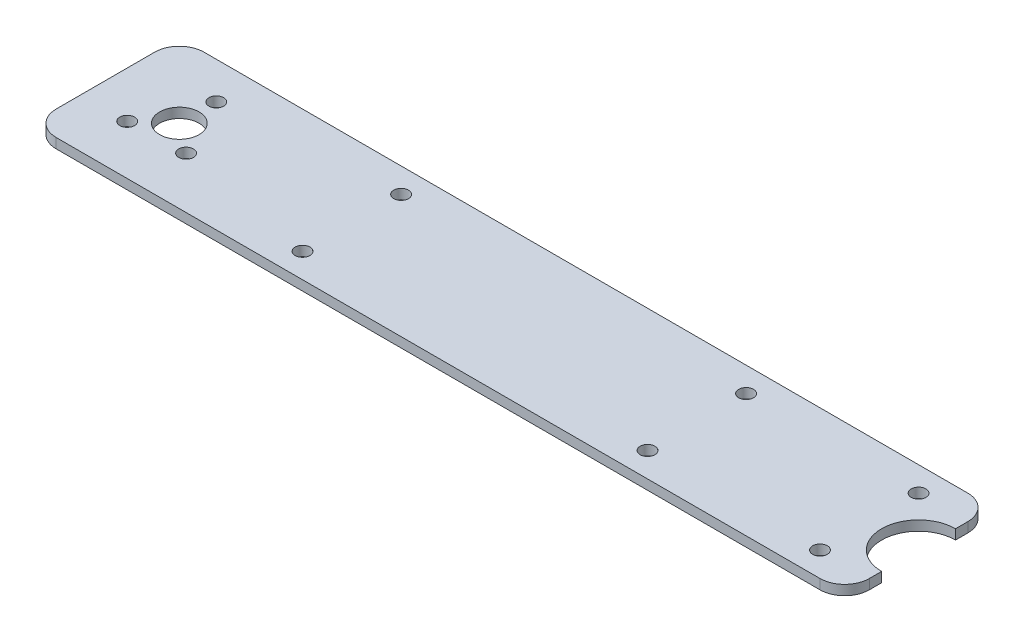
ISO-10303-21;
HEADER;
FILE_DESCRIPTION(('STEP AP214'),'2;1');
FILE_NAME('part.step','',(''),(''),'','','');
FILE_SCHEMA(('AUTOMOTIVE_DESIGN { 1 0 10303 214 1 1 1 1 }'));
ENDSEC;
DATA;
#1=APPLICATION_CONTEXT('core data for automotive mechanical design processes');
#2=APPLICATION_PROTOCOL_DEFINITION('international standard','automotive_design',2000,#1);
#3=PRODUCT_CONTEXT('',#1,'mechanical');
#4=PRODUCT('Part','Part','',(#3));
#5=PRODUCT_RELATED_PRODUCT_CATEGORY('part','',(#4));
#6=PRODUCT_DEFINITION_FORMATION('','',#4);
#7=PRODUCT_DEFINITION_CONTEXT('part definition',#1,'design');
#8=PRODUCT_DEFINITION('design','',#6,#7);
#9=PRODUCT_DEFINITION_SHAPE('','',#8);
#10=(LENGTH_UNIT() NAMED_UNIT(*) SI_UNIT(.MILLI.,.METRE.));
#11=(NAMED_UNIT(*) PLANE_ANGLE_UNIT() SI_UNIT($,.RADIAN.));
#12=(NAMED_UNIT(*) SI_UNIT($,.STERADIAN.) SOLID_ANGLE_UNIT());
#13=UNCERTAINTY_MEASURE_WITH_UNIT(LENGTH_MEASURE(1.E-05),#10,'distance_accuracy_value','');
#14=(GEOMETRIC_REPRESENTATION_CONTEXT(3) GLOBAL_UNCERTAINTY_ASSIGNED_CONTEXT((#13)) GLOBAL_UNIT_ASSIGNED_CONTEXT((#10,
#11,#12)) REPRESENTATION_CONTEXT('',''));
#15=CARTESIAN_POINT('',(0.,0.,0.));
#16=DIRECTION('',(0.,0.,1.));
#17=DIRECTION('',(1.,0.,0.));
#18=AXIS2_PLACEMENT_3D('',#15,#16,#17);
#19=CARTESIAN_POINT('',(82.5,2.,-15.));
#20=DIRECTION('',(-1.,0.,0.));
#21=DIRECTION('',(0.,0.,1.));
#22=AXIS2_PLACEMENT_3D('',#19,#20,#21);
#23=PLANE('',#22);
#24=DIRECTION('',(0.,0.,-1.));
#25=VECTOR('',#24,1.);
#26=CARTESIAN_POINT('',(82.5,0.,-15.));
#27=LINE('',#26,#25);
#28=CARTESIAN_POINT('',(82.5,0.,10.));
#29=VERTEX_POINT('',#28);
#30=CARTESIAN_POINT('',(82.5,0.,7.5));
#31=VERTEX_POINT('',#30);
#32=EDGE_CURVE('E126',#29,#31,#27,.T.);
#33=ORIENTED_EDGE('',*,*,#32,.T.);
#34=DIRECTION('',(0.,1.,0.));
#35=VECTOR('',#34,1.);
#36=CARTESIAN_POINT('',(82.5,-8.,7.5));
#37=LINE('',#36,#35);
#38=CARTESIAN_POINT('',(82.5,2.,7.5));
#39=VERTEX_POINT('',#38);
#40=EDGE_CURVE('E49',#31,#39,#37,.T.);
#41=ORIENTED_EDGE('',*,*,#40,.T.);
#42=DIRECTION('',(0.,0.,-1.));
#43=VECTOR('',#42,1.);
#44=CARTESIAN_POINT('',(82.5,2.,-15.));
#45=LINE('',#44,#43);
#46=CARTESIAN_POINT('',(82.5,2.,10.));
#47=VERTEX_POINT('',#46);
#48=EDGE_CURVE('E123',#47,#39,#45,.T.);
#49=ORIENTED_EDGE('',*,*,#48,.F.);
#50=DIRECTION('',(0.,-1.,0.));
#51=VECTOR('',#50,1.);
#52=CARTESIAN_POINT('',(82.5,2.,10.));
#53=LINE('',#52,#51);
#54=EDGE_CURVE('E160',#47,#29,#53,.T.);
#55=ORIENTED_EDGE('',*,*,#54,.T.);
#56=EDGE_LOOP('',(#33,#41,#49,#55));
#57=FACE_BOUND('',#56,.T.);
#58=ADVANCED_FACE('F32',(#57),#23,.F.);
#59=CARTESIAN_POINT('',(82.5,2.,-7.5));
#60=VERTEX_POINT('',#59);
#61=CARTESIAN_POINT('',(82.5,2.,-10.));
#62=VERTEX_POINT('',#61);
#63=EDGE_CURVE('E135',#60,#62,#45,.T.);
#64=ORIENTED_EDGE('',*,*,#63,.F.);
#65=DIRECTION('',(0.,1.,0.));
#66=VECTOR('',#65,1.);
#67=CARTESIAN_POINT('',(82.5,-8.,-7.5));
#68=LINE('',#67,#66);
#69=CARTESIAN_POINT('',(82.5,0.,-7.5));
#70=VERTEX_POINT('',#69);
#71=EDGE_CURVE('E113',#60,#70,#68,.F.);
#72=ORIENTED_EDGE('',*,*,#71,.T.);
#73=CARTESIAN_POINT('',(82.5,0.,-10.));
#74=VERTEX_POINT('',#73);
#75=EDGE_CURVE('E151',#70,#74,#27,.T.);
#76=ORIENTED_EDGE('',*,*,#75,.T.);
#77=DIRECTION('',(0.,-1.,0.));
#78=VECTOR('',#77,1.);
#79=CARTESIAN_POINT('',(82.5,2.,-10.));
#80=LINE('',#79,#78);
#81=EDGE_CURVE('E148',#74,#62,#80,.F.);
#82=ORIENTED_EDGE('',*,*,#81,.T.);
#83=EDGE_LOOP('',(#64,#72,#76,#82));
#84=FACE_BOUND('',#83,.T.);
#85=ADVANCED_FACE('F257',(#84),#23,.F.);
#86=CARTESIAN_POINT('',(-82.5,2.,-15.));
#87=DIRECTION('',(0.,0.,1.));
#88=DIRECTION('',(1.,0.,0.));
#89=AXIS2_PLACEMENT_3D('',#86,#87,#88);
#90=PLANE('',#89);
#91=DIRECTION('',(-1.,0.,0.));
#92=VECTOR('',#91,1.);
#93=CARTESIAN_POINT('',(-82.5,2.,-15.));
#94=LINE('',#93,#92);
#95=CARTESIAN_POINT('',(77.5,2.,-15.));
#96=VERTEX_POINT('',#95);
#97=CARTESIAN_POINT('',(-77.5,2.,-15.));
#98=VERTEX_POINT('',#97);
#99=EDGE_CURVE('E134',#96,#98,#94,.T.);
#100=ORIENTED_EDGE('',*,*,#99,.F.);
#101=DIRECTION('',(0.,-1.,0.));
#102=VECTOR('',#101,1.);
#103=CARTESIAN_POINT('',(77.5,2.,-15.));
#104=LINE('',#103,#102);
#105=CARTESIAN_POINT('',(77.5,0.,-15.));
#106=VERTEX_POINT('',#105);
#107=EDGE_CURVE('E185',#96,#106,#104,.T.);
#108=ORIENTED_EDGE('',*,*,#107,.T.);
#109=DIRECTION('',(-1.,0.,0.));
#110=VECTOR('',#109,1.);
#111=CARTESIAN_POINT('',(-82.5,0.,-15.));
#112=LINE('',#111,#110);
#113=CARTESIAN_POINT('',(-77.5,0.,-15.));
#114=VERTEX_POINT('',#113);
#115=EDGE_CURVE('E150',#106,#114,#112,.T.);
#116=ORIENTED_EDGE('',*,*,#115,.T.);
#117=DIRECTION('',(0.,-1.,0.));
#118=VECTOR('',#117,1.);
#119=CARTESIAN_POINT('',(-77.5,2.,-15.));
#120=LINE('',#119,#118);
#121=EDGE_CURVE('E183',#114,#98,#120,.F.);
#122=ORIENTED_EDGE('',*,*,#121,.T.);
#123=EDGE_LOOP('',(#100,#108,#116,#122));
#124=FACE_BOUND('',#123,.T.);
#125=ADVANCED_FACE('F262',(#124),#90,.F.);
#126=CARTESIAN_POINT('',(-82.5,2.,-15.));
#127=DIRECTION('',(1.,0.,0.));
#128=DIRECTION('',(0.,0.,-1.));
#129=AXIS2_PLACEMENT_3D('',#126,#127,#128);
#130=PLANE('',#129);
#131=DIRECTION('',(0.,0.,1.));
#132=VECTOR('',#131,1.);
#133=CARTESIAN_POINT('',(-82.5,2.,-15.));
#134=LINE('',#133,#132);
#135=CARTESIAN_POINT('',(-82.5,2.,-10.));
#136=VERTEX_POINT('',#135);
#137=CARTESIAN_POINT('',(-82.5,2.,10.));
#138=VERTEX_POINT('',#137);
#139=EDGE_CURVE('E138',#136,#138,#134,.T.);
#140=ORIENTED_EDGE('',*,*,#139,.F.);
#141=DIRECTION('',(0.,-1.,0.));
#142=VECTOR('',#141,1.);
#143=CARTESIAN_POINT('',(-82.5,2.,-10.));
#144=LINE('',#143,#142);
#145=CARTESIAN_POINT('',(-82.5,0.,-10.));
#146=VERTEX_POINT('',#145);
#147=EDGE_CURVE('E41',#136,#146,#144,.T.);
#148=ORIENTED_EDGE('',*,*,#147,.T.);
#149=DIRECTION('',(0.,0.,1.));
#150=VECTOR('',#149,1.);
#151=CARTESIAN_POINT('',(-82.5,0.,-15.));
#152=LINE('',#151,#150);
#153=CARTESIAN_POINT('',(-82.5,0.,10.));
#154=VERTEX_POINT('',#153);
#155=EDGE_CURVE('E154',#146,#154,#152,.T.);
#156=ORIENTED_EDGE('',*,*,#155,.T.);
#157=DIRECTION('',(0.,-1.,0.));
#158=VECTOR('',#157,1.);
#159=CARTESIAN_POINT('',(-82.5,2.,10.));
#160=LINE('',#159,#158);
#161=EDGE_CURVE('E56',#154,#138,#160,.F.);
#162=ORIENTED_EDGE('',*,*,#161,.T.);
#163=EDGE_LOOP('',(#140,#148,#156,#162));
#164=FACE_BOUND('',#163,.T.);
#165=ADVANCED_FACE('F250',(#164),#130,.F.);
#166=CARTESIAN_POINT('',(-82.5,2.,15.));
#167=DIRECTION('',(0.,0.,-1.));
#168=DIRECTION('',(-1.,0.,0.));
#169=AXIS2_PLACEMENT_3D('',#166,#167,#168);
#170=PLANE('',#169);
#171=DIRECTION('',(1.,0.,0.));
#172=VECTOR('',#171,1.);
#173=CARTESIAN_POINT('',(-82.5,0.,15.));
#174=LINE('',#173,#172);
#175=CARTESIAN_POINT('',(-77.5,0.,15.));
#176=VERTEX_POINT('',#175);
#177=CARTESIAN_POINT('',(77.5,0.,15.));
#178=VERTEX_POINT('',#177);
#179=EDGE_CURVE('E140',#176,#178,#174,.T.);
#180=ORIENTED_EDGE('',*,*,#179,.T.);
#181=DIRECTION('',(0.,-1.,0.));
#182=VECTOR('',#181,1.);
#183=CARTESIAN_POINT('',(77.5,2.,15.));
#184=LINE('',#183,#182);
#185=CARTESIAN_POINT('',(77.5,2.,15.));
#186=VERTEX_POINT('',#185);
#187=EDGE_CURVE('E174',#178,#186,#184,.F.);
#188=ORIENTED_EDGE('',*,*,#187,.T.);
#189=DIRECTION('',(1.,0.,0.));
#190=VECTOR('',#189,1.);
#191=CARTESIAN_POINT('',(-82.5,2.,15.));
#192=LINE('',#191,#190);
#193=CARTESIAN_POINT('',(-77.5,2.,15.));
#194=VERTEX_POINT('',#193);
#195=EDGE_CURVE('E146',#194,#186,#192,.T.);
#196=ORIENTED_EDGE('',*,*,#195,.F.);
#197=DIRECTION('',(0.,-1.,0.));
#198=VECTOR('',#197,1.);
#199=CARTESIAN_POINT('',(-77.5,2.,15.));
#200=LINE('',#199,#198);
#201=EDGE_CURVE('E171',#194,#176,#200,.T.);
#202=ORIENTED_EDGE('',*,*,#201,.T.);
#203=EDGE_LOOP('',(#180,#188,#196,#202));
#204=FACE_BOUND('',#203,.T.);
#205=ADVANCED_FACE('F240',(#204),#170,.F.);
#206=CARTESIAN_POINT('',(0.,2.,0.));
#207=DIRECTION('',(0.,1.,0.));
#208=DIRECTION('',(0.,0.,1.));
#209=AXIS2_PLACEMENT_3D('',#206,#207,#208);
#210=PLANE('',#209);
#211=CARTESIAN_POINT('',(72.5,2.,10.));
#212=DIRECTION('',(0.,1.,0.));
#213=DIRECTION('',(0.,0.,1.));
#214=AXIS2_PLACEMENT_3D('',#211,#212,#213);
#215=CIRCLE('',#214,1.5);
#216=CARTESIAN_POINT('',(72.5,2.,11.5));
#217=VERTEX_POINT('',#216);
#218=EDGE_CURVE('E464',#217,#217,#215,.T.);
#219=ORIENTED_EDGE('',*,*,#218,.F.);
#220=EDGE_LOOP('',(#219));
#221=FACE_BOUND('',#220,.T.);
#222=CARTESIAN_POINT('',(72.5,2.,-10.));
#223=DIRECTION('',(0.,1.,0.));
#224=DIRECTION('',(0.,0.,1.));
#225=AXIS2_PLACEMENT_3D('',#222,#223,#224);
#226=CIRCLE('',#225,1.5);
#227=CARTESIAN_POINT('',(72.5,2.,-8.5));
#228=VERTEX_POINT('',#227);
#229=EDGE_CURVE('E466',#228,#228,#226,.T.);
#230=ORIENTED_EDGE('',*,*,#229,.F.);
#231=EDGE_LOOP('',(#230));
#232=FACE_BOUND('',#231,.T.);
#233=CARTESIAN_POINT('',(37.5,2.,-10.));
#234=DIRECTION('',(0.,1.,0.));
#235=DIRECTION('',(0.,0.,1.));
#236=AXIS2_PLACEMENT_3D('',#233,#234,#235);
#237=CIRCLE('',#236,1.5);
#238=CARTESIAN_POINT('',(37.5,2.,-8.49999999999999));
#239=VERTEX_POINT('',#238);
#240=EDGE_CURVE('E197',#239,#239,#237,.T.);
#241=ORIENTED_EDGE('',*,*,#240,.F.);
#242=EDGE_LOOP('',(#241));
#243=FACE_BOUND('',#242,.T.);
#244=CARTESIAN_POINT('',(-32.5,2.,10.));
#245=DIRECTION('',(0.,1.,0.));
#246=DIRECTION('',(0.,0.,1.));
#247=AXIS2_PLACEMENT_3D('',#244,#245,#246);
#248=CIRCLE('',#247,1.5);
#249=CARTESIAN_POINT('',(-32.5,2.,11.5));
#250=VERTEX_POINT('',#249);
#251=EDGE_CURVE('E475',#250,#250,#248,.T.);
#252=ORIENTED_EDGE('',*,*,#251,.F.);
#253=EDGE_LOOP('',(#252));
#254=FACE_BOUND('',#253,.T.);
#255=CARTESIAN_POINT('',(37.5,2.,10.));
#256=DIRECTION('',(0.,1.,0.));
#257=DIRECTION('',(0.,0.,1.));
#258=AXIS2_PLACEMENT_3D('',#255,#256,#257);
#259=CIRCLE('',#258,1.5);
#260=CARTESIAN_POINT('',(37.5,2.,11.5));
#261=VERTEX_POINT('',#260);
#262=EDGE_CURVE('E209',#261,#261,#259,.T.);
#263=ORIENTED_EDGE('',*,*,#262,.F.);
#264=EDGE_LOOP('',(#263));
#265=FACE_BOUND('',#264,.T.);
#266=CARTESIAN_POINT('',(-32.5,2.,-10.));
#267=DIRECTION('',(0.,1.,0.));
#268=DIRECTION('',(0.,0.,1.));
#269=AXIS2_PLACEMENT_3D('',#266,#267,#268);
#270=CIRCLE('',#269,1.5);
#271=CARTESIAN_POINT('',(-32.5,2.,-8.49999999999999));
#272=VERTEX_POINT('',#271);
#273=EDGE_CURVE('E193',#272,#272,#270,.T.);
#274=ORIENTED_EDGE('',*,*,#273,.F.);
#275=EDGE_LOOP('',(#274));
#276=FACE_BOUND('',#275,.T.);
#277=CARTESIAN_POINT('',(82.5,2.,0.));
#278=DIRECTION('',(0.,1.,0.));
#279=DIRECTION('',(0.,0.,1.));
#280=AXIS2_PLACEMENT_3D('',#277,#278,#279);
#281=CIRCLE('',#280,7.5);
#282=EDGE_CURVE('E110',#60,#39,#281,.T.);
#283=ORIENTED_EDGE('',*,*,#282,.F.);
#284=ORIENTED_EDGE('',*,*,#63,.T.);
#285=CARTESIAN_POINT('',(77.5,2.,-10.));
#286=DIRECTION('',(0.,1.,0.));
#287=DIRECTION('',(0.,0.,1.));
#288=AXIS2_PLACEMENT_3D('',#285,#286,#287);
#289=CIRCLE('',#288,5.);
#290=EDGE_CURVE('E180',#62,#96,#289,.T.);
#291=ORIENTED_EDGE('',*,*,#290,.T.);
#292=ORIENTED_EDGE('',*,*,#99,.T.);
#293=CARTESIAN_POINT('',(-77.5,2.,-10.));
#294=DIRECTION('',(0.,1.,0.));
#295=DIRECTION('',(0.,0.,1.));
#296=AXIS2_PLACEMENT_3D('',#293,#294,#295);
#297=CIRCLE('',#296,5.);
#298=EDGE_CURVE('E178',#98,#136,#297,.T.);
#299=ORIENTED_EDGE('',*,*,#298,.T.);
#300=ORIENTED_EDGE('',*,*,#139,.T.);
#301=CARTESIAN_POINT('',(-77.5,2.,10.));
#302=DIRECTION('',(0.,1.,0.));
#303=DIRECTION('',(0.,0.,1.));
#304=AXIS2_PLACEMENT_3D('',#301,#302,#303);
#305=CIRCLE('',#304,5.);
#306=EDGE_CURVE('E176',#138,#194,#305,.T.);
#307=ORIENTED_EDGE('',*,*,#306,.T.);
#308=ORIENTED_EDGE('',*,*,#195,.T.);
#309=CARTESIAN_POINT('',(77.5,2.,10.));
#310=DIRECTION('',(0.,1.,0.));
#311=DIRECTION('',(0.,0.,1.));
#312=AXIS2_PLACEMENT_3D('',#309,#310,#311);
#313=CIRCLE('',#312,5.);
#314=EDGE_CURVE('E133',#186,#47,#313,.T.);
#315=ORIENTED_EDGE('',*,*,#314,.T.);
#316=ORIENTED_EDGE('',*,*,#48,.T.);
#317=EDGE_LOOP('',(#283,#284,#291,#292,#299,#300,#307,#308,#315,#316));
#318=FACE_BOUND('',#317,.T.);
#319=CARTESIAN_POINT('',(-61.5550610887533,2.,4.57249399579103));
#320=DIRECTION('',(0.,1.,0.));
#321=DIRECTION('',(0.,0.,1.));
#322=AXIS2_PLACEMENT_3D('',#319,#320,#321);
#323=CIRCLE('',#322,1.5);
#324=CARTESIAN_POINT('',(-61.5550610887533,2.,6.07249399579103));
#325=VERTEX_POINT('',#324);
#326=EDGE_CURVE('E216',#325,#325,#323,.T.);
#327=ORIENTED_EDGE('',*,*,#326,.F.);
#328=EDGE_LOOP('',(#327));
#329=FACE_BOUND('',#328,.T.);
#330=CARTESIAN_POINT('',(-67.5,2.,-7.5));
#331=DIRECTION('',(0.,1.,0.));
#332=DIRECTION('',(0.,0.,1.));
#333=AXIS2_PLACEMENT_3D('',#330,#331,#332);
#334=CIRCLE('',#333,1.5);
#335=CARTESIAN_POINT('',(-67.5,2.,-6.));
#336=VERTEX_POINT('',#335);
#337=EDGE_CURVE('E222',#336,#336,#334,.T.);
#338=ORIENTED_EDGE('',*,*,#337,.F.);
#339=EDGE_LOOP('',(#338));
#340=FACE_BOUND('',#339,.T.);
#341=CARTESIAN_POINT('',(-73.1309882435168,2.,4.95398540585008));
#342=DIRECTION('',(0.,1.,0.));
#343=DIRECTION('',(0.,0.,1.));
#344=AXIS2_PLACEMENT_3D('',#341,#342,#343);
#345=CIRCLE('',#344,1.5);
#346=CARTESIAN_POINT('',(-73.1309882435168,2.,6.45398540585008));
#347=VERTEX_POINT('',#346);
#348=EDGE_CURVE('E127',#347,#347,#345,.T.);
#349=ORIENTED_EDGE('',*,*,#348,.F.);
#350=EDGE_LOOP('',(#349));
#351=FACE_BOUND('',#350,.T.);
#352=CARTESIAN_POINT('',(-67.5,2.,0.));
#353=DIRECTION('',(0.,1.,0.));
#354=DIRECTION('',(0.,0.,1.));
#355=AXIS2_PLACEMENT_3D('',#352,#353,#354);
#356=CIRCLE('',#355,4.00000000000001);
#357=CARTESIAN_POINT('',(-67.5,2.,4.00000000000001));
#358=VERTEX_POINT('',#357);
#359=EDGE_CURVE('E142',#358,#358,#356,.T.);
#360=ORIENTED_EDGE('',*,*,#359,.F.);
#361=EDGE_LOOP('',(#360));
#362=FACE_BOUND('',#361,.T.);
#363=ADVANCED_FACE('F129',(#221,#232,#243,#254,#265,#276,#318,#329,#340,#351,#362),#210,.T.);
#364=CARTESIAN_POINT('',(0.,0.,0.));
#365=DIRECTION('',(0.,1.,0.));
#366=DIRECTION('',(0.,0.,1.));
#367=AXIS2_PLACEMENT_3D('',#364,#365,#366);
#368=PLANE('',#367);
#369=CARTESIAN_POINT('',(72.5,0.,10.));
#370=DIRECTION('',(0.,1.,0.));
#371=DIRECTION('',(0.,0.,1.));
#372=AXIS2_PLACEMENT_3D('',#369,#370,#371);
#373=CIRCLE('',#372,1.5);
#374=CARTESIAN_POINT('',(72.5,0.,11.5));
#375=VERTEX_POINT('',#374);
#376=EDGE_CURVE('E462',#375,#375,#373,.T.);
#377=ORIENTED_EDGE('',*,*,#376,.T.);
#378=EDGE_LOOP('',(#377));
#379=FACE_BOUND('',#378,.T.);
#380=CARTESIAN_POINT('',(72.5,0.,-10.));
#381=DIRECTION('',(0.,1.,0.));
#382=DIRECTION('',(0.,0.,1.));
#383=AXIS2_PLACEMENT_3D('',#380,#381,#382);
#384=CIRCLE('',#383,1.5);
#385=CARTESIAN_POINT('',(72.5,0.,-8.5));
#386=VERTEX_POINT('',#385);
#387=EDGE_CURVE('E469',#386,#386,#384,.T.);
#388=ORIENTED_EDGE('',*,*,#387,.T.);
#389=EDGE_LOOP('',(#388));
#390=FACE_BOUND('',#389,.T.);
#391=CARTESIAN_POINT('',(37.5,0.,-10.));
#392=DIRECTION('',(0.,1.,0.));
#393=DIRECTION('',(0.,0.,1.));
#394=AXIS2_PLACEMENT_3D('',#391,#392,#393);
#395=CIRCLE('',#394,1.5);
#396=CARTESIAN_POINT('',(37.5,0.,-8.49999999999999));
#397=VERTEX_POINT('',#396);
#398=EDGE_CURVE('E36',#397,#397,#395,.T.);
#399=ORIENTED_EDGE('',*,*,#398,.T.);
#400=EDGE_LOOP('',(#399));
#401=FACE_BOUND('',#400,.T.);
#402=CARTESIAN_POINT('',(-32.5,0.,10.));
#403=DIRECTION('',(0.,1.,0.));
#404=DIRECTION('',(0.,0.,1.));
#405=AXIS2_PLACEMENT_3D('',#402,#403,#404);
#406=CIRCLE('',#405,1.5);
#407=CARTESIAN_POINT('',(-32.5,0.,11.5));
#408=VERTEX_POINT('',#407);
#409=EDGE_CURVE('E196',#408,#408,#406,.T.);
#410=ORIENTED_EDGE('',*,*,#409,.T.);
#411=EDGE_LOOP('',(#410));
#412=FACE_BOUND('',#411,.T.);
#413=CARTESIAN_POINT('',(37.5,0.,10.));
#414=DIRECTION('',(0.,1.,0.));
#415=DIRECTION('',(0.,0.,1.));
#416=AXIS2_PLACEMENT_3D('',#413,#414,#415);
#417=CIRCLE('',#416,1.5);
#418=CARTESIAN_POINT('',(37.5,0.,11.5));
#419=VERTEX_POINT('',#418);
#420=EDGE_CURVE('E194',#419,#419,#417,.T.);
#421=ORIENTED_EDGE('',*,*,#420,.T.);
#422=EDGE_LOOP('',(#421));
#423=FACE_BOUND('',#422,.T.);
#424=CARTESIAN_POINT('',(-32.5,0.,-10.));
#425=DIRECTION('',(0.,1.,0.));
#426=DIRECTION('',(0.,0.,1.));
#427=AXIS2_PLACEMENT_3D('',#424,#425,#426);
#428=CIRCLE('',#427,1.5);
#429=CARTESIAN_POINT('',(-32.5,0.,-8.49999999999999));
#430=VERTEX_POINT('',#429);
#431=EDGE_CURVE('E117',#430,#430,#428,.T.);
#432=ORIENTED_EDGE('',*,*,#431,.T.);
#433=EDGE_LOOP('',(#432));
#434=FACE_BOUND('',#433,.T.);
#435=CARTESIAN_POINT('',(-61.5550610887533,0.,4.57249399579103));
#436=DIRECTION('',(0.,1.,0.));
#437=DIRECTION('',(0.,0.,1.));
#438=AXIS2_PLACEMENT_3D('',#435,#436,#437);
#439=CIRCLE('',#438,1.5);
#440=CARTESIAN_POINT('',(-61.5550610887533,0.,6.07249399579103));
#441=VERTEX_POINT('',#440);
#442=EDGE_CURVE('E213',#441,#441,#439,.T.);
#443=ORIENTED_EDGE('',*,*,#442,.T.);
#444=EDGE_LOOP('',(#443));
#445=FACE_BOUND('',#444,.T.);
#446=CARTESIAN_POINT('',(-67.5,0.,-7.5));
#447=DIRECTION('',(0.,1.,0.));
#448=DIRECTION('',(0.,0.,1.));
#449=AXIS2_PLACEMENT_3D('',#446,#447,#448);
#450=CIRCLE('',#449,1.5);
#451=CARTESIAN_POINT('',(-67.5,0.,-6.));
#452=VERTEX_POINT('',#451);
#453=EDGE_CURVE('E219',#452,#452,#450,.T.);
#454=ORIENTED_EDGE('',*,*,#453,.T.);
#455=EDGE_LOOP('',(#454));
#456=FACE_BOUND('',#455,.T.);
#457=CARTESIAN_POINT('',(-73.1309882435168,0.,4.95398540585008));
#458=DIRECTION('',(0.,1.,0.));
#459=DIRECTION('',(0.,0.,1.));
#460=AXIS2_PLACEMENT_3D('',#457,#458,#459);
#461=CIRCLE('',#460,1.5);
#462=CARTESIAN_POINT('',(-73.1309882435168,0.,6.45398540585008));
#463=VERTEX_POINT('',#462);
#464=EDGE_CURVE('E225',#463,#463,#461,.T.);
#465=ORIENTED_EDGE('',*,*,#464,.T.);
#466=EDGE_LOOP('',(#465));
#467=FACE_BOUND('',#466,.T.);
#468=CARTESIAN_POINT('',(-67.5,0.,0.));
#469=DIRECTION('',(0.,1.,0.));
#470=DIRECTION('',(0.,0.,1.));
#471=AXIS2_PLACEMENT_3D('',#468,#469,#470);
#472=CIRCLE('',#471,4.00000000000001);
#473=CARTESIAN_POINT('',(-67.5,0.,4.00000000000001));
#474=VERTEX_POINT('',#473);
#475=EDGE_CURVE('E229',#474,#474,#472,.T.);
#476=ORIENTED_EDGE('',*,*,#475,.T.);
#477=EDGE_LOOP('',(#476));
#478=FACE_BOUND('',#477,.T.);
#479=ORIENTED_EDGE('',*,*,#75,.F.);
#480=CARTESIAN_POINT('',(82.5,0.,0.));
#481=DIRECTION('',(0.,1.,0.));
#482=DIRECTION('',(0.,0.,1.));
#483=AXIS2_PLACEMENT_3D('',#480,#481,#482);
#484=CIRCLE('',#483,7.5);
#485=EDGE_CURVE('E11',#70,#31,#484,.T.);
#486=ORIENTED_EDGE('',*,*,#485,.T.);
#487=ORIENTED_EDGE('',*,*,#32,.F.);
#488=CARTESIAN_POINT('',(77.5,0.,10.));
#489=DIRECTION('',(0.,1.,0.));
#490=DIRECTION('',(0.,0.,1.));
#491=AXIS2_PLACEMENT_3D('',#488,#489,#490);
#492=CIRCLE('',#491,5.);
#493=EDGE_CURVE('E169',#29,#178,#492,.F.);
#494=ORIENTED_EDGE('',*,*,#493,.T.);
#495=ORIENTED_EDGE('',*,*,#179,.F.);
#496=CARTESIAN_POINT('',(-77.5,0.,10.));
#497=DIRECTION('',(0.,1.,0.));
#498=DIRECTION('',(0.,0.,1.));
#499=AXIS2_PLACEMENT_3D('',#496,#497,#498);
#500=CIRCLE('',#499,5.);
#501=EDGE_CURVE('E162',#176,#154,#500,.F.);
#502=ORIENTED_EDGE('',*,*,#501,.T.);
#503=ORIENTED_EDGE('',*,*,#155,.F.);
#504=CARTESIAN_POINT('',(-77.5,0.,-10.));
#505=DIRECTION('',(0.,1.,0.));
#506=DIRECTION('',(0.,0.,1.));
#507=AXIS2_PLACEMENT_3D('',#504,#505,#506);
#508=CIRCLE('',#507,5.);
#509=EDGE_CURVE('E164',#146,#114,#508,.F.);
#510=ORIENTED_EDGE('',*,*,#509,.T.);
#511=ORIENTED_EDGE('',*,*,#115,.F.);
#512=CARTESIAN_POINT('',(77.5,0.,-10.));
#513=DIRECTION('',(0.,1.,0.));
#514=DIRECTION('',(0.,0.,1.));
#515=AXIS2_PLACEMENT_3D('',#512,#513,#514);
#516=CIRCLE('',#515,5.);
#517=EDGE_CURVE('E166',#106,#74,#516,.F.);
#518=ORIENTED_EDGE('',*,*,#517,.T.);
#519=EDGE_LOOP('',(#479,#486,#487,#494,#495,#502,#503,#510,#511,#518));
#520=FACE_BOUND('',#519,.T.);
#521=ADVANCED_FACE('F239',(#379,#390,#401,#412,#423,#434,#445,#456,#467,#478,#520),#368,.F.);
#522=CARTESIAN_POINT('',(77.5,2.,10.));
#523=DIRECTION('',(0.,-1.,0.));
#524=DIRECTION('',(0.,0.,-1.));
#525=AXIS2_PLACEMENT_3D('',#522,#523,#524);
#526=CYLINDRICAL_SURFACE('',#525,5.);
#527=ORIENTED_EDGE('',*,*,#314,.F.);
#528=ORIENTED_EDGE('',*,*,#187,.F.);
#529=ORIENTED_EDGE('',*,*,#493,.F.);
#530=ORIENTED_EDGE('',*,*,#54,.F.);
#531=EDGE_LOOP('',(#527,#528,#529,#530));
#532=FACE_BOUND('',#531,.T.);
#533=ADVANCED_FACE('F247',(#532),#526,.T.);
#534=CARTESIAN_POINT('',(77.5,2.,-10.));
#535=DIRECTION('',(0.,-1.,0.));
#536=DIRECTION('',(0.,0.,-1.));
#537=AXIS2_PLACEMENT_3D('',#534,#535,#536);
#538=CYLINDRICAL_SURFACE('',#537,5.);
#539=ORIENTED_EDGE('',*,*,#290,.F.);
#540=ORIENTED_EDGE('',*,*,#81,.F.);
#541=ORIENTED_EDGE('',*,*,#517,.F.);
#542=ORIENTED_EDGE('',*,*,#107,.F.);
#543=EDGE_LOOP('',(#539,#540,#541,#542));
#544=FACE_BOUND('',#543,.T.);
#545=ADVANCED_FACE('F269',(#544),#538,.T.);
#546=CARTESIAN_POINT('',(-77.5,2.,-10.));
#547=DIRECTION('',(0.,-1.,0.));
#548=DIRECTION('',(0.,0.,-1.));
#549=AXIS2_PLACEMENT_3D('',#546,#547,#548);
#550=CYLINDRICAL_SURFACE('',#549,5.);
#551=ORIENTED_EDGE('',*,*,#298,.F.);
#552=ORIENTED_EDGE('',*,*,#121,.F.);
#553=ORIENTED_EDGE('',*,*,#509,.F.);
#554=ORIENTED_EDGE('',*,*,#147,.F.);
#555=EDGE_LOOP('',(#551,#552,#553,#554));
#556=FACE_BOUND('',#555,.T.);
#557=ADVANCED_FACE('F272',(#556),#550,.T.);
#558=CARTESIAN_POINT('',(-77.5,2.,10.));
#559=DIRECTION('',(0.,-1.,0.));
#560=DIRECTION('',(0.,0.,-1.));
#561=AXIS2_PLACEMENT_3D('',#558,#559,#560);
#562=CYLINDRICAL_SURFACE('',#561,5.);
#563=ORIENTED_EDGE('',*,*,#306,.F.);
#564=ORIENTED_EDGE('',*,*,#161,.F.);
#565=ORIENTED_EDGE('',*,*,#501,.F.);
#566=ORIENTED_EDGE('',*,*,#201,.F.);
#567=EDGE_LOOP('',(#563,#564,#565,#566));
#568=FACE_BOUND('',#567,.T.);
#569=ADVANCED_FACE('F34',(#568),#562,.T.);
#570=CARTESIAN_POINT('',(-67.5,0.,0.));
#571=DIRECTION('',(0.,1.,0.));
#572=DIRECTION('',(0.,0.,1.));
#573=AXIS2_PLACEMENT_3D('',#570,#571,#572);
#574=CYLINDRICAL_SURFACE('',#573,4.00000000000001);
#575=ORIENTED_EDGE('',*,*,#475,.F.);
#576=EDGE_LOOP('',(#575));
#577=FACE_BOUND('',#576,.T.);
#578=ORIENTED_EDGE('',*,*,#359,.T.);
#579=EDGE_LOOP('',(#578));
#580=FACE_BOUND('',#579,.T.);
#581=ADVANCED_FACE('F236',(#577,#580),#574,.F.);
#582=CARTESIAN_POINT('',(-73.1309882435168,0.,4.95398540585008));
#583=DIRECTION('',(0.,1.,0.));
#584=DIRECTION('',(0.,0.,1.));
#585=AXIS2_PLACEMENT_3D('',#582,#583,#584);
#586=CYLINDRICAL_SURFACE('',#585,1.5);
#587=ORIENTED_EDGE('',*,*,#464,.F.);
#588=EDGE_LOOP('',(#587));
#589=FACE_BOUND('',#588,.T.);
#590=ORIENTED_EDGE('',*,*,#348,.T.);
#591=EDGE_LOOP('',(#590));
#592=FACE_BOUND('',#591,.T.);
#593=ADVANCED_FACE('F340',(#589,#592),#586,.F.);
#594=CARTESIAN_POINT('',(-67.5,0.,-7.5));
#595=DIRECTION('',(0.,1.,0.));
#596=DIRECTION('',(0.,0.,1.));
#597=AXIS2_PLACEMENT_3D('',#594,#595,#596);
#598=CYLINDRICAL_SURFACE('',#597,1.5);
#599=ORIENTED_EDGE('',*,*,#453,.F.);
#600=EDGE_LOOP('',(#599));
#601=FACE_BOUND('',#600,.T.);
#602=ORIENTED_EDGE('',*,*,#337,.T.);
#603=EDGE_LOOP('',(#602));
#604=FACE_BOUND('',#603,.T.);
#605=ADVANCED_FACE('F349',(#601,#604),#598,.F.);
#606=CARTESIAN_POINT('',(-61.5550610887533,0.,4.57249399579103));
#607=DIRECTION('',(0.,1.,0.));
#608=DIRECTION('',(0.,0.,1.));
#609=AXIS2_PLACEMENT_3D('',#606,#607,#608);
#610=CYLINDRICAL_SURFACE('',#609,1.5);
#611=ORIENTED_EDGE('',*,*,#442,.F.);
#612=EDGE_LOOP('',(#611));
#613=FACE_BOUND('',#612,.T.);
#614=ORIENTED_EDGE('',*,*,#326,.T.);
#615=EDGE_LOOP('',(#614));
#616=FACE_BOUND('',#615,.T.);
#617=ADVANCED_FACE('F359',(#613,#616),#610,.F.);
#618=CARTESIAN_POINT('',(82.5,-8.,0.));
#619=DIRECTION('',(0.,1.,0.));
#620=DIRECTION('',(0.,0.,1.));
#621=AXIS2_PLACEMENT_3D('',#618,#619,#620);
#622=CYLINDRICAL_SURFACE('',#621,7.5);
#623=ORIENTED_EDGE('',*,*,#485,.F.);
#624=ORIENTED_EDGE('',*,*,#71,.F.);
#625=ORIENTED_EDGE('',*,*,#282,.T.);
#626=ORIENTED_EDGE('',*,*,#40,.F.);
#627=EDGE_LOOP('',(#623,#624,#625,#626));
#628=FACE_BOUND('',#627,.T.);
#629=ADVANCED_FACE('F111',(#628),#622,.F.);
#630=CARTESIAN_POINT('',(-32.5,-8.,-10.));
#631=DIRECTION('',(0.,1.,0.));
#632=DIRECTION('',(0.,0.,1.));
#633=AXIS2_PLACEMENT_3D('',#630,#631,#632);
#634=CYLINDRICAL_SURFACE('',#633,1.5);
#635=ORIENTED_EDGE('',*,*,#273,.T.);
#636=EDGE_LOOP('',(#635));
#637=FACE_BOUND('',#636,.T.);
#638=ORIENTED_EDGE('',*,*,#431,.F.);
#639=EDGE_LOOP('',(#638));
#640=FACE_BOUND('',#639,.T.);
#641=ADVANCED_FACE('F389',(#637,#640),#634,.F.);
#642=CARTESIAN_POINT('',(37.5,-8.,10.));
#643=DIRECTION('',(0.,1.,0.));
#644=DIRECTION('',(0.,0.,1.));
#645=AXIS2_PLACEMENT_3D('',#642,#643,#644);
#646=CYLINDRICAL_SURFACE('',#645,1.5);
#647=ORIENTED_EDGE('',*,*,#262,.T.);
#648=EDGE_LOOP('',(#647));
#649=FACE_BOUND('',#648,.T.);
#650=ORIENTED_EDGE('',*,*,#420,.F.);
#651=EDGE_LOOP('',(#650));
#652=FACE_BOUND('',#651,.T.);
#653=ADVANCED_FACE('F398',(#649,#652),#646,.F.);
#654=CARTESIAN_POINT('',(-32.5,-8.,10.));
#655=DIRECTION('',(0.,1.,0.));
#656=DIRECTION('',(0.,0.,1.));
#657=AXIS2_PLACEMENT_3D('',#654,#655,#656);
#658=CYLINDRICAL_SURFACE('',#657,1.5);
#659=ORIENTED_EDGE('',*,*,#251,.T.);
#660=EDGE_LOOP('',(#659));
#661=FACE_BOUND('',#660,.T.);
#662=ORIENTED_EDGE('',*,*,#409,.F.);
#663=EDGE_LOOP('',(#662));
#664=FACE_BOUND('',#663,.T.);
#665=ADVANCED_FACE('F407',(#661,#664),#658,.F.);
#666=CARTESIAN_POINT('',(37.5,-8.,-10.));
#667=DIRECTION('',(0.,1.,0.));
#668=DIRECTION('',(0.,0.,1.));
#669=AXIS2_PLACEMENT_3D('',#666,#667,#668);
#670=CYLINDRICAL_SURFACE('',#669,1.5);
#671=ORIENTED_EDGE('',*,*,#240,.T.);
#672=EDGE_LOOP('',(#671));
#673=FACE_BOUND('',#672,.T.);
#674=ORIENTED_EDGE('',*,*,#398,.F.);
#675=EDGE_LOOP('',(#674));
#676=FACE_BOUND('',#675,.T.);
#677=ADVANCED_FACE('F417',(#673,#676),#670,.F.);
#678=CARTESIAN_POINT('',(72.5,0.,-10.));
#679=DIRECTION('',(0.,1.,0.));
#680=DIRECTION('',(0.,0.,1.));
#681=AXIS2_PLACEMENT_3D('',#678,#679,#680);
#682=CYLINDRICAL_SURFACE('',#681,1.5);
#683=ORIENTED_EDGE('',*,*,#387,.F.);
#684=EDGE_LOOP('',(#683));
#685=FACE_BOUND('',#684,.T.);
#686=ORIENTED_EDGE('',*,*,#229,.T.);
#687=EDGE_LOOP('',(#686));
#688=FACE_BOUND('',#687,.T.);
#689=ADVANCED_FACE('F426',(#685,#688),#682,.F.);
#690=CARTESIAN_POINT('',(72.5,0.,10.));
#691=DIRECTION('',(0.,1.,0.));
#692=DIRECTION('',(0.,0.,1.));
#693=AXIS2_PLACEMENT_3D('',#690,#691,#692);
#694=CYLINDRICAL_SURFACE('',#693,1.5);
#695=ORIENTED_EDGE('',*,*,#376,.F.);
#696=EDGE_LOOP('',(#695));
#697=FACE_BOUND('',#696,.T.);
#698=ORIENTED_EDGE('',*,*,#218,.T.);
#699=EDGE_LOOP('',(#698));
#700=FACE_BOUND('',#699,.T.);
#701=ADVANCED_FACE('F445',(#697,#700),#694,.F.);
#702=CLOSED_SHELL('',(#58,#85,#125,#165,#205,#363,#521,#533,#545,#557,#569,#581,#593,#605,#617,
#629,#641,#653,#665,#677,#689,#701));
#703=MANIFOLD_SOLID_BREP('B2',#702);
#704=ADVANCED_BREP_SHAPE_REPRESENTATION('',(#18,#703),#14);
#705=SHAPE_DEFINITION_REPRESENTATION(#9,#704);
ENDSEC;
END-ISO-10303-21;
